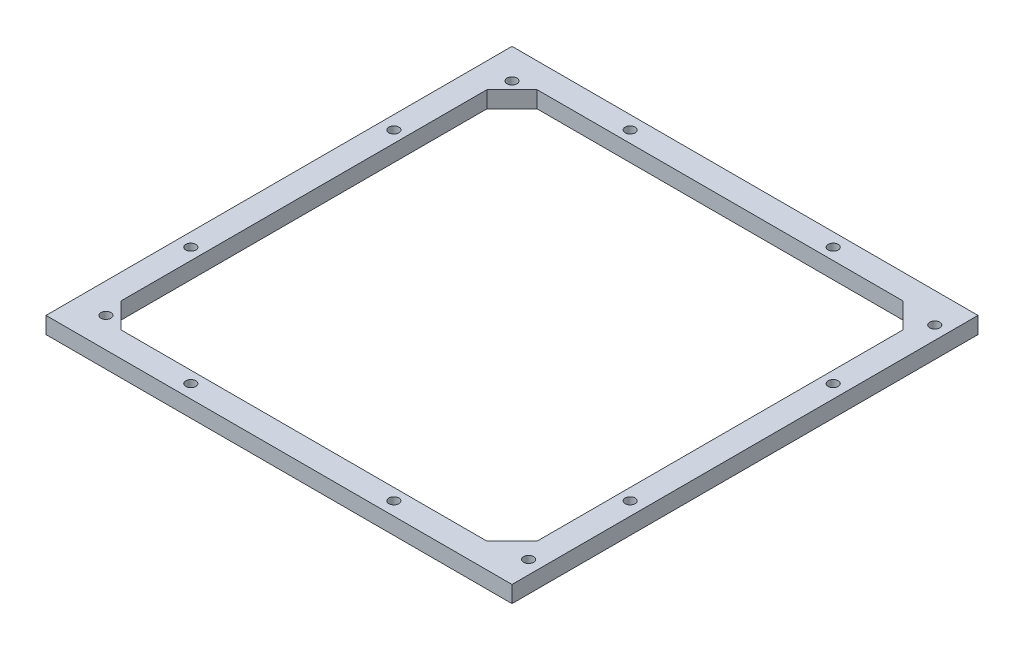
ISO-10303-21;
HEADER;
FILE_DESCRIPTION(('STEP AP214'),'2;1');
FILE_NAME('part.step','',(''),(''),'','','');
FILE_SCHEMA(('AUTOMOTIVE_DESIGN { 1 0 10303 214 1 1 1 1 }'));
ENDSEC;
DATA;
#1=APPLICATION_CONTEXT('core data for automotive mechanical design processes');
#2=APPLICATION_PROTOCOL_DEFINITION('international standard','automotive_design',2000,#1);
#3=PRODUCT_CONTEXT('',#1,'mechanical');
#4=PRODUCT('Part','Part','',(#3));
#5=PRODUCT_RELATED_PRODUCT_CATEGORY('part','',(#4));
#6=PRODUCT_DEFINITION_FORMATION('','',#4);
#7=PRODUCT_DEFINITION_CONTEXT('part definition',#1,'design');
#8=PRODUCT_DEFINITION('design','',#6,#7);
#9=PRODUCT_DEFINITION_SHAPE('','',#8);
#10=(LENGTH_UNIT() NAMED_UNIT(*) SI_UNIT(.MILLI.,.METRE.));
#11=(NAMED_UNIT(*) PLANE_ANGLE_UNIT() SI_UNIT($,.RADIAN.));
#12=(NAMED_UNIT(*) SI_UNIT($,.STERADIAN.) SOLID_ANGLE_UNIT());
#13=UNCERTAINTY_MEASURE_WITH_UNIT(LENGTH_MEASURE(1.E-05),#10,'distance_accuracy_value','');
#14=(GEOMETRIC_REPRESENTATION_CONTEXT(3) GLOBAL_UNCERTAINTY_ASSIGNED_CONTEXT((#13)) GLOBAL_UNIT_ASSIGNED_CONTEXT((#10,
#11,#12)) REPRESENTATION_CONTEXT('',''));
#15=CARTESIAN_POINT('',(0.,0.,0.));
#16=DIRECTION('',(0.,0.,1.));
#17=DIRECTION('',(1.,0.,0.));
#18=AXIS2_PLACEMENT_3D('',#15,#16,#17);
#19=CARTESIAN_POINT('',(0.,5.,0.));
#20=DIRECTION('',(0.,1.,0.));
#21=DIRECTION('',(0.,0.,1.));
#22=AXIS2_PLACEMENT_3D('',#19,#20,#21);
#23=PLANE('',#22);
#24=CARTESIAN_POINT('',(-66.,5.,-30.5));
#25=DIRECTION('',(0.,1.,0.));
#26=DIRECTION('',(0.,0.,-1.));
#27=AXIS2_PLACEMENT_3D('',#24,#25,#26);
#28=CIRCLE('',#27,1.5);
#29=CARTESIAN_POINT('',(-66.,5.,-32.));
#30=VERTEX_POINT('',#29);
#31=EDGE_CURVE('E346',#30,#30,#28,.T.);
#32=ORIENTED_EDGE('',*,*,#31,.F.);
#33=EDGE_LOOP('',(#32));
#34=FACE_BOUND('',#33,.T.);
#35=CARTESIAN_POINT('',(-30.5,5.,-66.));
#36=DIRECTION('',(0.,1.,0.));
#37=DIRECTION('',(0.,0.,-1.));
#38=AXIS2_PLACEMENT_3D('',#35,#36,#37);
#39=CIRCLE('',#38,1.5);
#40=CARTESIAN_POINT('',(-30.5,5.,-67.5));
#41=VERTEX_POINT('',#40);
#42=EDGE_CURVE('E358',#41,#41,#39,.T.);
#43=ORIENTED_EDGE('',*,*,#42,.F.);
#44=EDGE_LOOP('',(#43));
#45=FACE_BOUND('',#44,.T.);
#46=CARTESIAN_POINT('',(-30.5,5.,66.));
#47=DIRECTION('',(0.,1.,0.));
#48=DIRECTION('',(0.,0.,1.));
#49=AXIS2_PLACEMENT_3D('',#46,#47,#48);
#50=CIRCLE('',#49,1.5);
#51=CARTESIAN_POINT('',(-30.5,5.,67.5));
#52=VERTEX_POINT('',#51);
#53=EDGE_CURVE('E370',#52,#52,#50,.T.);
#54=ORIENTED_EDGE('',*,*,#53,.F.);
#55=EDGE_LOOP('',(#54));
#56=FACE_BOUND('',#55,.T.);
#57=CARTESIAN_POINT('',(66.,5.,-30.5));
#58=DIRECTION('',(0.,1.,0.));
#59=DIRECTION('',(0.,0.,1.));
#60=AXIS2_PLACEMENT_3D('',#57,#58,#59);
#61=CIRCLE('',#60,1.5);
#62=CARTESIAN_POINT('',(66.,5.,-29.));
#63=VERTEX_POINT('',#62);
#64=EDGE_CURVE('E382',#63,#63,#61,.T.);
#65=ORIENTED_EDGE('',*,*,#64,.F.);
#66=EDGE_LOOP('',(#65));
#67=FACE_BOUND('',#66,.T.);
#68=CARTESIAN_POINT('',(66.,5.,61.));
#69=DIRECTION('',(0.,1.,0.));
#70=DIRECTION('',(0.,0.,1.));
#71=AXIS2_PLACEMENT_3D('',#68,#69,#70);
#72=CIRCLE('',#71,1.5);
#73=CARTESIAN_POINT('',(66.,5.,62.5));
#74=VERTEX_POINT('',#73);
#75=EDGE_CURVE('E394',#74,#74,#72,.T.);
#76=ORIENTED_EDGE('',*,*,#75,.F.);
#77=EDGE_LOOP('',(#76));
#78=FACE_BOUND('',#77,.T.);
#79=CARTESIAN_POINT('',(-61.,5.,-61.));
#80=DIRECTION('',(0.,1.,0.));
#81=DIRECTION('',(0.,0.,1.));
#82=AXIS2_PLACEMENT_3D('',#79,#80,#81);
#83=CIRCLE('',#82,1.5);
#84=CARTESIAN_POINT('',(-61.,5.,-59.5));
#85=VERTEX_POINT('',#84);
#86=EDGE_CURVE('E160',#85,#85,#83,.T.);
#87=ORIENTED_EDGE('',*,*,#86,.F.);
#88=EDGE_LOOP('',(#87));
#89=FACE_BOUND('',#88,.T.);
#90=DIRECTION('',(0.,0.,1.));
#91=VECTOR('',#90,1.);
#92=CARTESIAN_POINT('',(-70.,5.,70.));
#93=LINE('',#92,#91);
#94=CARTESIAN_POINT('',(-70.,5.,-70.));
#95=VERTEX_POINT('',#94);
#96=CARTESIAN_POINT('',(-70.,5.,70.));
#97=VERTEX_POINT('',#96);
#98=EDGE_CURVE('E190',#95,#97,#93,.T.);
#99=ORIENTED_EDGE('',*,*,#98,.T.);
#100=DIRECTION('',(1.,0.,0.));
#101=VECTOR('',#100,1.);
#102=CARTESIAN_POINT('',(70.,5.,70.));
#103=LINE('',#102,#101);
#104=CARTESIAN_POINT('',(70.,5.,70.));
#105=VERTEX_POINT('',#104);
#106=EDGE_CURVE('E193',#97,#105,#103,.T.);
#107=ORIENTED_EDGE('',*,*,#106,.T.);
#108=DIRECTION('',(0.,0.,-1.));
#109=VECTOR('',#108,1.);
#110=CARTESIAN_POINT('',(70.,5.,70.));
#111=LINE('',#110,#109);
#112=CARTESIAN_POINT('',(70.,5.,-70.));
#113=VERTEX_POINT('',#112);
#114=EDGE_CURVE('E196',#105,#113,#111,.T.);
#115=ORIENTED_EDGE('',*,*,#114,.T.);
#116=DIRECTION('',(-1.,0.,0.));
#117=VECTOR('',#116,1.);
#118=CARTESIAN_POINT('',(70.,5.,-70.));
#119=LINE('',#118,#117);
#120=EDGE_CURVE('E198',#113,#95,#119,.T.);
#121=ORIENTED_EDGE('',*,*,#120,.T.);
#122=EDGE_LOOP('',(#99,#107,#115,#121));
#123=FACE_BOUND('',#122,.T.);
#124=DIRECTION('',(0.,0.,1.));
#125=VECTOR('',#124,1.);
#126=CARTESIAN_POINT('',(-62.5,5.,55.));
#127=LINE('',#126,#125);
#128=CARTESIAN_POINT('',(-62.5,5.,-55.));
#129=VERTEX_POINT('',#128);
#130=CARTESIAN_POINT('',(-62.5,5.,55.));
#131=VERTEX_POINT('',#130);
#132=EDGE_CURVE('E130',#129,#131,#127,.T.);
#133=ORIENTED_EDGE('',*,*,#132,.F.);
#134=DIRECTION('',(-0.707106781186547,0.,0.707106781186548));
#135=VECTOR('',#134,1.);
#136=CARTESIAN_POINT('',(-62.5,5.,-55.));
#137=LINE('',#136,#135);
#138=CARTESIAN_POINT('',(-55.,5.,-62.5));
#139=VERTEX_POINT('',#138);
#140=EDGE_CURVE('E122',#139,#129,#137,.T.);
#141=ORIENTED_EDGE('',*,*,#140,.F.);
#142=DIRECTION('',(-1.,0.,0.));
#143=VECTOR('',#142,1.);
#144=CARTESIAN_POINT('',(-55.,5.,-62.5));
#145=LINE('',#144,#143);
#146=CARTESIAN_POINT('',(55.,5.,-62.5));
#147=VERTEX_POINT('',#146);
#148=EDGE_CURVE('E157',#147,#139,#145,.T.);
#149=ORIENTED_EDGE('',*,*,#148,.F.);
#150=DIRECTION('',(-0.707106781186548,0.,-0.707106781186547));
#151=VECTOR('',#150,1.);
#152=CARTESIAN_POINT('',(55.,5.,-62.5));
#153=LINE('',#152,#151);
#154=CARTESIAN_POINT('',(62.5,5.,-55.));
#155=VERTEX_POINT('',#154);
#156=EDGE_CURVE('E155',#155,#147,#153,.T.);
#157=ORIENTED_EDGE('',*,*,#156,.F.);
#158=DIRECTION('',(0.,0.,-1.));
#159=VECTOR('',#158,1.);
#160=CARTESIAN_POINT('',(62.5,5.,-55.));
#161=LINE('',#160,#159);
#162=CARTESIAN_POINT('',(62.5,5.,55.));
#163=VERTEX_POINT('',#162);
#164=EDGE_CURVE('E153',#163,#155,#161,.T.);
#165=ORIENTED_EDGE('',*,*,#164,.F.);
#166=DIRECTION('',(0.707106781186547,0.,-0.707106781186548));
#167=VECTOR('',#166,1.);
#168=CARTESIAN_POINT('',(62.5,5.,55.));
#169=LINE('',#168,#167);
#170=CARTESIAN_POINT('',(55.,5.,62.5));
#171=VERTEX_POINT('',#170);
#172=EDGE_CURVE('E151',#171,#163,#169,.T.);
#173=ORIENTED_EDGE('',*,*,#172,.F.);
#174=DIRECTION('',(1.,0.,0.));
#175=VECTOR('',#174,1.);
#176=CARTESIAN_POINT('',(55.,5.,62.5));
#177=LINE('',#176,#175);
#178=CARTESIAN_POINT('',(-55.,5.,62.5));
#179=VERTEX_POINT('',#178);
#180=EDGE_CURVE('E146',#179,#171,#177,.T.);
#181=ORIENTED_EDGE('',*,*,#180,.F.);
#182=DIRECTION('',(0.707106781186548,0.,0.707106781186547));
#183=VECTOR('',#182,1.);
#184=CARTESIAN_POINT('',(-55.,5.,62.5));
#185=LINE('',#184,#183);
#186=EDGE_CURVE('E144',#131,#179,#185,.T.);
#187=ORIENTED_EDGE('',*,*,#186,.F.);
#188=EDGE_LOOP('',(#133,#141,#149,#157,#165,#173,#181,#187));
#189=FACE_BOUND('',#188,.T.);
#190=CARTESIAN_POINT('',(66.,5.,-61.));
#191=DIRECTION('',(0.,1.,0.));
#192=DIRECTION('',(0.,0.,1.));
#193=AXIS2_PLACEMENT_3D('',#190,#191,#192);
#194=CIRCLE('',#193,1.5);
#195=CARTESIAN_POINT('',(66.,5.,-59.5));
#196=VERTEX_POINT('',#195);
#197=EDGE_CURVE('E400',#196,#196,#194,.T.);
#198=ORIENTED_EDGE('',*,*,#197,.F.);
#199=EDGE_LOOP('',(#198));
#200=FACE_BOUND('',#199,.T.);
#201=CARTESIAN_POINT('',(-61.,5.,61.));
#202=DIRECTION('',(0.,1.,0.));
#203=DIRECTION('',(0.,0.,1.));
#204=AXIS2_PLACEMENT_3D('',#201,#202,#203);
#205=CIRCLE('',#204,1.5);
#206=CARTESIAN_POINT('',(-61.,5.,62.5));
#207=VERTEX_POINT('',#206);
#208=EDGE_CURVE('E388',#207,#207,#205,.T.);
#209=ORIENTED_EDGE('',*,*,#208,.F.);
#210=EDGE_LOOP('',(#209));
#211=FACE_BOUND('',#210,.T.);
#212=CARTESIAN_POINT('',(66.,5.,30.5));
#213=DIRECTION('',(0.,1.,0.));
#214=DIRECTION('',(0.,0.,1.));
#215=AXIS2_PLACEMENT_3D('',#212,#213,#214);
#216=CIRCLE('',#215,1.5);
#217=CARTESIAN_POINT('',(66.,5.,32.));
#218=VERTEX_POINT('',#217);
#219=EDGE_CURVE('E376',#218,#218,#216,.T.);
#220=ORIENTED_EDGE('',*,*,#219,.F.);
#221=EDGE_LOOP('',(#220));
#222=FACE_BOUND('',#221,.T.);
#223=CARTESIAN_POINT('',(30.5,5.,66.));
#224=DIRECTION('',(0.,1.,0.));
#225=DIRECTION('',(0.,0.,1.));
#226=AXIS2_PLACEMENT_3D('',#223,#224,#225);
#227=CIRCLE('',#226,1.5);
#228=CARTESIAN_POINT('',(30.5,5.,67.5));
#229=VERTEX_POINT('',#228);
#230=EDGE_CURVE('E364',#229,#229,#227,.T.);
#231=ORIENTED_EDGE('',*,*,#230,.F.);
#232=EDGE_LOOP('',(#231));
#233=FACE_BOUND('',#232,.T.);
#234=CARTESIAN_POINT('',(30.5,5.,-66.));
#235=DIRECTION('',(0.,1.,0.));
#236=DIRECTION('',(0.,0.,-1.));
#237=AXIS2_PLACEMENT_3D('',#234,#235,#236);
#238=CIRCLE('',#237,1.5);
#239=CARTESIAN_POINT('',(30.5,5.,-67.5));
#240=VERTEX_POINT('',#239);
#241=EDGE_CURVE('E352',#240,#240,#238,.T.);
#242=ORIENTED_EDGE('',*,*,#241,.F.);
#243=EDGE_LOOP('',(#242));
#244=FACE_BOUND('',#243,.T.);
#245=CARTESIAN_POINT('',(-66.,5.,30.5));
#246=DIRECTION('',(0.,1.,0.));
#247=DIRECTION('',(0.,0.,-1.));
#248=AXIS2_PLACEMENT_3D('',#245,#246,#247);
#249=CIRCLE('',#248,1.5);
#250=CARTESIAN_POINT('',(-66.,5.,29.));
#251=VERTEX_POINT('',#250);
#252=EDGE_CURVE('E337',#251,#251,#249,.T.);
#253=ORIENTED_EDGE('',*,*,#252,.F.);
#254=EDGE_LOOP('',(#253));
#255=FACE_BOUND('',#254,.T.);
#256=ADVANCED_FACE('F33',(#34,#45,#56,#67,#78,#89,#123,#189,#200,#211,#222,#233,#244,#255),#23,.T.);
#257=CARTESIAN_POINT('',(0.,0.,0.));
#258=DIRECTION('',(0.,1.,0.));
#259=DIRECTION('',(0.,0.,1.));
#260=AXIS2_PLACEMENT_3D('',#257,#258,#259);
#261=PLANE('',#260);
#262=DIRECTION('',(0.,0.,1.));
#263=VECTOR('',#262,1.);
#264=CARTESIAN_POINT('',(-70.,0.,70.));
#265=LINE('',#264,#263);
#266=CARTESIAN_POINT('',(-70.,0.,-70.));
#267=VERTEX_POINT('',#266);
#268=CARTESIAN_POINT('',(-70.,0.,70.));
#269=VERTEX_POINT('',#268);
#270=EDGE_CURVE('E138',#267,#269,#265,.T.);
#271=ORIENTED_EDGE('',*,*,#270,.F.);
#272=DIRECTION('',(-1.,0.,0.));
#273=VECTOR('',#272,1.);
#274=CARTESIAN_POINT('',(70.,0.,-70.));
#275=LINE('',#274,#273);
#276=CARTESIAN_POINT('',(70.,0.,-70.));
#277=VERTEX_POINT('',#276);
#278=EDGE_CURVE('E194',#277,#267,#275,.T.);
#279=ORIENTED_EDGE('',*,*,#278,.F.);
#280=DIRECTION('',(0.,0.,-1.));
#281=VECTOR('',#280,1.);
#282=CARTESIAN_POINT('',(70.,0.,70.));
#283=LINE('',#282,#281);
#284=CARTESIAN_POINT('',(70.,0.,70.));
#285=VERTEX_POINT('',#284);
#286=EDGE_CURVE('E205',#285,#277,#283,.T.);
#287=ORIENTED_EDGE('',*,*,#286,.F.);
#288=DIRECTION('',(1.,0.,0.));
#289=VECTOR('',#288,1.);
#290=CARTESIAN_POINT('',(70.,0.,70.));
#291=LINE('',#290,#289);
#292=EDGE_CURVE('E203',#269,#285,#291,.T.);
#293=ORIENTED_EDGE('',*,*,#292,.F.);
#294=EDGE_LOOP('',(#271,#279,#287,#293));
#295=FACE_BOUND('',#294,.T.);
#296=DIRECTION('',(-0.707106781186547,0.,0.707106781186548));
#297=VECTOR('',#296,1.);
#298=CARTESIAN_POINT('',(-62.5,0.,-55.));
#299=LINE('',#298,#297);
#300=CARTESIAN_POINT('',(-55.,0.,-62.5));
#301=VERTEX_POINT('',#300);
#302=CARTESIAN_POINT('',(-62.5,0.,-55.));
#303=VERTEX_POINT('',#302);
#304=EDGE_CURVE('E56',#301,#303,#299,.T.);
#305=ORIENTED_EDGE('',*,*,#304,.T.);
#306=DIRECTION('',(0.,0.,1.));
#307=VECTOR('',#306,1.);
#308=CARTESIAN_POINT('',(-62.5,0.,55.));
#309=LINE('',#308,#307);
#310=CARTESIAN_POINT('',(-62.5,0.,55.));
#311=VERTEX_POINT('',#310);
#312=EDGE_CURVE('E137',#303,#311,#309,.T.);
#313=ORIENTED_EDGE('',*,*,#312,.T.);
#314=DIRECTION('',(0.707106781186548,0.,0.707106781186547));
#315=VECTOR('',#314,1.);
#316=CARTESIAN_POINT('',(-55.,0.,62.5));
#317=LINE('',#316,#315);
#318=CARTESIAN_POINT('',(-55.,0.,62.5));
#319=VERTEX_POINT('',#318);
#320=EDGE_CURVE('E162',#311,#319,#317,.T.);
#321=ORIENTED_EDGE('',*,*,#320,.T.);
#322=DIRECTION('',(1.,0.,0.));
#323=VECTOR('',#322,1.);
#324=CARTESIAN_POINT('',(55.,0.,62.5));
#325=LINE('',#324,#323);
#326=CARTESIAN_POINT('',(55.,0.,62.5));
#327=VERTEX_POINT('',#326);
#328=EDGE_CURVE('E165',#319,#327,#325,.T.);
#329=ORIENTED_EDGE('',*,*,#328,.T.);
#330=DIRECTION('',(0.707106781186547,0.,-0.707106781186548));
#331=VECTOR('',#330,1.);
#332=CARTESIAN_POINT('',(62.5,0.,55.));
#333=LINE('',#332,#331);
#334=CARTESIAN_POINT('',(62.5,0.,55.));
#335=VERTEX_POINT('',#334);
#336=EDGE_CURVE('E168',#327,#335,#333,.T.);
#337=ORIENTED_EDGE('',*,*,#336,.T.);
#338=DIRECTION('',(0.,0.,-1.));
#339=VECTOR('',#338,1.);
#340=CARTESIAN_POINT('',(62.5,0.,-55.));
#341=LINE('',#340,#339);
#342=CARTESIAN_POINT('',(62.5,0.,-55.));
#343=VERTEX_POINT('',#342);
#344=EDGE_CURVE('E171',#335,#343,#341,.T.);
#345=ORIENTED_EDGE('',*,*,#344,.T.);
#346=DIRECTION('',(-0.707106781186548,0.,-0.707106781186547));
#347=VECTOR('',#346,1.);
#348=CARTESIAN_POINT('',(55.,0.,-62.5));
#349=LINE('',#348,#347);
#350=CARTESIAN_POINT('',(55.,0.,-62.5));
#351=VERTEX_POINT('',#350);
#352=EDGE_CURVE('E174',#343,#351,#349,.T.);
#353=ORIENTED_EDGE('',*,*,#352,.T.);
#354=DIRECTION('',(-1.,0.,0.));
#355=VECTOR('',#354,1.);
#356=CARTESIAN_POINT('',(-55.,0.,-62.5));
#357=LINE('',#356,#355);
#358=EDGE_CURVE('E131',#351,#301,#357,.T.);
#359=ORIENTED_EDGE('',*,*,#358,.T.);
#360=EDGE_LOOP('',(#305,#313,#321,#329,#337,#345,#353,#359));
#361=FACE_BOUND('',#360,.T.);
#362=CARTESIAN_POINT('',(-61.,0.,-61.));
#363=DIRECTION('',(0.,1.,0.));
#364=DIRECTION('',(0.,0.,1.));
#365=AXIS2_PLACEMENT_3D('',#362,#363,#364);
#366=CIRCLE('',#365,1.5);
#367=CARTESIAN_POINT('',(-61.,0.,-59.5));
#368=VERTEX_POINT('',#367);
#369=EDGE_CURVE('E403',#368,#368,#366,.T.);
#370=ORIENTED_EDGE('',*,*,#369,.T.);
#371=EDGE_LOOP('',(#370));
#372=FACE_BOUND('',#371,.T.);
#373=CARTESIAN_POINT('',(66.,0.,-61.));
#374=DIRECTION('',(0.,1.,0.));
#375=DIRECTION('',(0.,0.,1.));
#376=AXIS2_PLACEMENT_3D('',#373,#374,#375);
#377=CIRCLE('',#376,1.5);
#378=CARTESIAN_POINT('',(66.,0.,-59.5));
#379=VERTEX_POINT('',#378);
#380=EDGE_CURVE('E397',#379,#379,#377,.T.);
#381=ORIENTED_EDGE('',*,*,#380,.T.);
#382=EDGE_LOOP('',(#381));
#383=FACE_BOUND('',#382,.T.);
#384=CARTESIAN_POINT('',(66.,0.,61.));
#385=DIRECTION('',(0.,1.,0.));
#386=DIRECTION('',(0.,0.,1.));
#387=AXIS2_PLACEMENT_3D('',#384,#385,#386);
#388=CIRCLE('',#387,1.5);
#389=CARTESIAN_POINT('',(66.,0.,62.5));
#390=VERTEX_POINT('',#389);
#391=EDGE_CURVE('E391',#390,#390,#388,.T.);
#392=ORIENTED_EDGE('',*,*,#391,.T.);
#393=EDGE_LOOP('',(#392));
#394=FACE_BOUND('',#393,.T.);
#395=CARTESIAN_POINT('',(-61.,0.,61.));
#396=DIRECTION('',(0.,1.,0.));
#397=DIRECTION('',(0.,0.,1.));
#398=AXIS2_PLACEMENT_3D('',#395,#396,#397);
#399=CIRCLE('',#398,1.5);
#400=CARTESIAN_POINT('',(-61.,0.,62.5));
#401=VERTEX_POINT('',#400);
#402=EDGE_CURVE('E385',#401,#401,#399,.T.);
#403=ORIENTED_EDGE('',*,*,#402,.T.);
#404=EDGE_LOOP('',(#403));
#405=FACE_BOUND('',#404,.T.);
#406=CARTESIAN_POINT('',(66.,0.,-30.5));
#407=DIRECTION('',(0.,1.,0.));
#408=DIRECTION('',(0.,0.,1.));
#409=AXIS2_PLACEMENT_3D('',#406,#407,#408);
#410=CIRCLE('',#409,1.5);
#411=CARTESIAN_POINT('',(66.,0.,-29.));
#412=VERTEX_POINT('',#411);
#413=EDGE_CURVE('E379',#412,#412,#410,.T.);
#414=ORIENTED_EDGE('',*,*,#413,.T.);
#415=EDGE_LOOP('',(#414));
#416=FACE_BOUND('',#415,.T.);
#417=CARTESIAN_POINT('',(66.,0.,30.5));
#418=DIRECTION('',(0.,1.,0.));
#419=DIRECTION('',(0.,0.,1.));
#420=AXIS2_PLACEMENT_3D('',#417,#418,#419);
#421=CIRCLE('',#420,1.5);
#422=CARTESIAN_POINT('',(66.,0.,32.));
#423=VERTEX_POINT('',#422);
#424=EDGE_CURVE('E373',#423,#423,#421,.T.);
#425=ORIENTED_EDGE('',*,*,#424,.T.);
#426=EDGE_LOOP('',(#425));
#427=FACE_BOUND('',#426,.T.);
#428=CARTESIAN_POINT('',(-30.5,0.,66.));
#429=DIRECTION('',(0.,1.,0.));
#430=DIRECTION('',(0.,0.,1.));
#431=AXIS2_PLACEMENT_3D('',#428,#429,#430);
#432=CIRCLE('',#431,1.5);
#433=CARTESIAN_POINT('',(-30.5,0.,67.5));
#434=VERTEX_POINT('',#433);
#435=EDGE_CURVE('E367',#434,#434,#432,.T.);
#436=ORIENTED_EDGE('',*,*,#435,.T.);
#437=EDGE_LOOP('',(#436));
#438=FACE_BOUND('',#437,.T.);
#439=CARTESIAN_POINT('',(30.5,0.,66.));
#440=DIRECTION('',(0.,1.,0.));
#441=DIRECTION('',(0.,0.,1.));
#442=AXIS2_PLACEMENT_3D('',#439,#440,#441);
#443=CIRCLE('',#442,1.5);
#444=CARTESIAN_POINT('',(30.5,0.,67.5));
#445=VERTEX_POINT('',#444);
#446=EDGE_CURVE('E361',#445,#445,#443,.T.);
#447=ORIENTED_EDGE('',*,*,#446,.T.);
#448=EDGE_LOOP('',(#447));
#449=FACE_BOUND('',#448,.T.);
#450=CARTESIAN_POINT('',(-30.5,0.,-66.));
#451=DIRECTION('',(0.,1.,0.));
#452=DIRECTION('',(0.,0.,-1.));
#453=AXIS2_PLACEMENT_3D('',#450,#451,#452);
#454=CIRCLE('',#453,1.5);
#455=CARTESIAN_POINT('',(-30.5,0.,-67.5));
#456=VERTEX_POINT('',#455);
#457=EDGE_CURVE('E355',#456,#456,#454,.T.);
#458=ORIENTED_EDGE('',*,*,#457,.T.);
#459=EDGE_LOOP('',(#458));
#460=FACE_BOUND('',#459,.T.);
#461=CARTESIAN_POINT('',(30.5,0.,-66.));
#462=DIRECTION('',(0.,1.,0.));
#463=DIRECTION('',(0.,0.,-1.));
#464=AXIS2_PLACEMENT_3D('',#461,#462,#463);
#465=CIRCLE('',#464,1.5);
#466=CARTESIAN_POINT('',(30.5,0.,-67.5));
#467=VERTEX_POINT('',#466);
#468=EDGE_CURVE('E349',#467,#467,#465,.T.);
#469=ORIENTED_EDGE('',*,*,#468,.T.);
#470=EDGE_LOOP('',(#469));
#471=FACE_BOUND('',#470,.T.);
#472=CARTESIAN_POINT('',(-66.,0.,-30.5));
#473=DIRECTION('',(0.,1.,0.));
#474=DIRECTION('',(0.,0.,-1.));
#475=AXIS2_PLACEMENT_3D('',#472,#473,#474);
#476=CIRCLE('',#475,1.5);
#477=CARTESIAN_POINT('',(-66.,0.,-32.));
#478=VERTEX_POINT('',#477);
#479=EDGE_CURVE('E343',#478,#478,#476,.T.);
#480=ORIENTED_EDGE('',*,*,#479,.T.);
#481=EDGE_LOOP('',(#480));
#482=FACE_BOUND('',#481,.T.);
#483=CARTESIAN_POINT('',(-66.,0.,30.5));
#484=DIRECTION('',(0.,1.,0.));
#485=DIRECTION('',(0.,0.,-1.));
#486=AXIS2_PLACEMENT_3D('',#483,#484,#485);
#487=CIRCLE('',#486,1.5);
#488=CARTESIAN_POINT('',(-66.,0.,29.));
#489=VERTEX_POINT('',#488);
#490=EDGE_CURVE('E340',#489,#489,#487,.T.);
#491=ORIENTED_EDGE('',*,*,#490,.T.);
#492=EDGE_LOOP('',(#491));
#493=FACE_BOUND('',#492,.T.);
#494=ADVANCED_FACE('F223',(#295,#361,#372,#383,#394,#405,#416,#427,#438,#449,#460,#471,#482,
#493),#261,.F.);
#495=CARTESIAN_POINT('',(-70.,5.,70.));
#496=DIRECTION('',(1.,0.,0.));
#497=DIRECTION('',(0.,0.,-1.));
#498=AXIS2_PLACEMENT_3D('',#495,#496,#497);
#499=PLANE('',#498);
#500=ORIENTED_EDGE('',*,*,#270,.T.);
#501=DIRECTION('',(0.,-1.,0.));
#502=VECTOR('',#501,1.);
#503=CARTESIAN_POINT('',(-70.,5.,70.));
#504=LINE('',#503,#502);
#505=EDGE_CURVE('E11',#97,#269,#504,.T.);
#506=ORIENTED_EDGE('',*,*,#505,.F.);
#507=ORIENTED_EDGE('',*,*,#98,.F.);
#508=DIRECTION('',(0.,-1.,0.));
#509=VECTOR('',#508,1.);
#510=CARTESIAN_POINT('',(-70.,5.,-70.));
#511=LINE('',#510,#509);
#512=EDGE_CURVE('E200',#95,#267,#511,.T.);
#513=ORIENTED_EDGE('',*,*,#512,.T.);
#514=EDGE_LOOP('',(#500,#506,#507,#513));
#515=FACE_BOUND('',#514,.T.);
#516=ADVANCED_FACE('F35',(#515),#499,.F.);
#517=CARTESIAN_POINT('',(70.,5.,70.));
#518=DIRECTION('',(0.,0.,-1.));
#519=DIRECTION('',(-1.,0.,0.));
#520=AXIS2_PLACEMENT_3D('',#517,#518,#519);
#521=PLANE('',#520);
#522=ORIENTED_EDGE('',*,*,#292,.T.);
#523=DIRECTION('',(0.,-1.,0.));
#524=VECTOR('',#523,1.);
#525=CARTESIAN_POINT('',(70.,5.,70.));
#526=LINE('',#525,#524);
#527=EDGE_CURVE('E41',#105,#285,#526,.T.);
#528=ORIENTED_EDGE('',*,*,#527,.F.);
#529=ORIENTED_EDGE('',*,*,#106,.F.);
#530=ORIENTED_EDGE('',*,*,#505,.T.);
#531=EDGE_LOOP('',(#522,#528,#529,#530));
#532=FACE_BOUND('',#531,.T.);
#533=ADVANCED_FACE('F233',(#532),#521,.F.);
#534=CARTESIAN_POINT('',(70.,5.,70.));
#535=DIRECTION('',(-1.,0.,0.));
#536=DIRECTION('',(0.,0.,1.));
#537=AXIS2_PLACEMENT_3D('',#534,#535,#536);
#538=PLANE('',#537);
#539=ORIENTED_EDGE('',*,*,#286,.T.);
#540=DIRECTION('',(0.,-1.,0.));
#541=VECTOR('',#540,1.);
#542=CARTESIAN_POINT('',(70.,5.,-70.));
#543=LINE('',#542,#541);
#544=EDGE_CURVE('E210',#113,#277,#543,.T.);
#545=ORIENTED_EDGE('',*,*,#544,.F.);
#546=ORIENTED_EDGE('',*,*,#114,.F.);
#547=ORIENTED_EDGE('',*,*,#527,.T.);
#548=EDGE_LOOP('',(#539,#545,#546,#547));
#549=FACE_BOUND('',#548,.T.);
#550=ADVANCED_FACE('F217',(#549),#538,.F.);
#551=CARTESIAN_POINT('',(70.,5.,-70.));
#552=DIRECTION('',(0.,0.,1.));
#553=DIRECTION('',(1.,0.,0.));
#554=AXIS2_PLACEMENT_3D('',#551,#552,#553);
#555=PLANE('',#554);
#556=ORIENTED_EDGE('',*,*,#278,.T.);
#557=ORIENTED_EDGE('',*,*,#512,.F.);
#558=ORIENTED_EDGE('',*,*,#120,.F.);
#559=ORIENTED_EDGE('',*,*,#544,.T.);
#560=EDGE_LOOP('',(#556,#557,#558,#559));
#561=FACE_BOUND('',#560,.T.);
#562=ADVANCED_FACE('F227',(#561),#555,.F.);
#563=CARTESIAN_POINT('',(-62.5,5.,-55.));
#564=DIRECTION('',(0.707106781186548,0.,0.707106781186547));
#565=DIRECTION('',(0.707106781186547,0.,-0.707106781186548));
#566=AXIS2_PLACEMENT_3D('',#563,#564,#565);
#567=PLANE('',#566);
#568=ORIENTED_EDGE('',*,*,#304,.F.);
#569=DIRECTION('',(0.,-1.,0.));
#570=VECTOR('',#569,1.);
#571=CARTESIAN_POINT('',(-55.,5.,-62.5));
#572=LINE('',#571,#570);
#573=EDGE_CURVE('E126',#139,#301,#572,.T.);
#574=ORIENTED_EDGE('',*,*,#573,.F.);
#575=ORIENTED_EDGE('',*,*,#140,.T.);
#576=DIRECTION('',(0.,-1.,0.));
#577=VECTOR('',#576,1.);
#578=CARTESIAN_POINT('',(-62.5,5.,-55.));
#579=LINE('',#578,#577);
#580=EDGE_CURVE('E125',#129,#303,#579,.T.);
#581=ORIENTED_EDGE('',*,*,#580,.T.);
#582=EDGE_LOOP('',(#568,#574,#575,#581));
#583=FACE_BOUND('',#582,.T.);
#584=ADVANCED_FACE('F124',(#583),#567,.T.);
#585=CARTESIAN_POINT('',(-62.5,5.,55.));
#586=DIRECTION('',(1.,0.,0.));
#587=DIRECTION('',(0.,0.,-1.));
#588=AXIS2_PLACEMENT_3D('',#585,#586,#587);
#589=PLANE('',#588);
#590=ORIENTED_EDGE('',*,*,#312,.F.);
#591=ORIENTED_EDGE('',*,*,#580,.F.);
#592=ORIENTED_EDGE('',*,*,#132,.T.);
#593=DIRECTION('',(0.,-1.,0.));
#594=VECTOR('',#593,1.);
#595=CARTESIAN_POINT('',(-62.5,5.,55.));
#596=LINE('',#595,#594);
#597=EDGE_CURVE('E139',#131,#311,#596,.T.);
#598=ORIENTED_EDGE('',*,*,#597,.T.);
#599=EDGE_LOOP('',(#590,#591,#592,#598));
#600=FACE_BOUND('',#599,.T.);
#601=ADVANCED_FACE('F134',(#600),#589,.T.);
#602=CARTESIAN_POINT('',(-55.,5.,62.5));
#603=DIRECTION('',(0.707106781186547,0.,-0.707106781186548));
#604=DIRECTION('',(-0.707106781186548,0.,-0.707106781186547));
#605=AXIS2_PLACEMENT_3D('',#602,#603,#604);
#606=PLANE('',#605);
#607=ORIENTED_EDGE('',*,*,#320,.F.);
#608=ORIENTED_EDGE('',*,*,#597,.F.);
#609=ORIENTED_EDGE('',*,*,#186,.T.);
#610=DIRECTION('',(0.,-1.,0.));
#611=VECTOR('',#610,1.);
#612=CARTESIAN_POINT('',(-55.,5.,62.5));
#613=LINE('',#612,#611);
#614=EDGE_CURVE('E187',#179,#319,#613,.T.);
#615=ORIENTED_EDGE('',*,*,#614,.T.);
#616=EDGE_LOOP('',(#607,#608,#609,#615));
#617=FACE_BOUND('',#616,.T.);
#618=ADVANCED_FACE('F259',(#617),#606,.T.);
#619=CARTESIAN_POINT('',(55.,5.,62.5));
#620=DIRECTION('',(0.,0.,-1.));
#621=DIRECTION('',(-1.,0.,0.));
#622=AXIS2_PLACEMENT_3D('',#619,#620,#621);
#623=PLANE('',#622);
#624=ORIENTED_EDGE('',*,*,#328,.F.);
#625=ORIENTED_EDGE('',*,*,#614,.F.);
#626=ORIENTED_EDGE('',*,*,#180,.T.);
#627=DIRECTION('',(0.,-1.,0.));
#628=VECTOR('',#627,1.);
#629=CARTESIAN_POINT('',(55.,5.,62.5));
#630=LINE('',#629,#628);
#631=EDGE_CURVE('E185',#171,#327,#630,.T.);
#632=ORIENTED_EDGE('',*,*,#631,.T.);
#633=EDGE_LOOP('',(#624,#625,#626,#632));
#634=FACE_BOUND('',#633,.T.);
#635=ADVANCED_FACE('F263',(#634),#623,.T.);
#636=CARTESIAN_POINT('',(62.5,5.,55.));
#637=DIRECTION('',(-0.707106781186548,0.,-0.707106781186547));
#638=DIRECTION('',(-0.707106781186547,0.,0.707106781186548));
#639=AXIS2_PLACEMENT_3D('',#636,#637,#638);
#640=PLANE('',#639);
#641=ORIENTED_EDGE('',*,*,#336,.F.);
#642=ORIENTED_EDGE('',*,*,#631,.F.);
#643=ORIENTED_EDGE('',*,*,#172,.T.);
#644=DIRECTION('',(0.,-1.,0.));
#645=VECTOR('',#644,1.);
#646=CARTESIAN_POINT('',(62.5,5.,55.));
#647=LINE('',#646,#645);
#648=EDGE_CURVE('E183',#163,#335,#647,.T.);
#649=ORIENTED_EDGE('',*,*,#648,.T.);
#650=EDGE_LOOP('',(#641,#642,#643,#649));
#651=FACE_BOUND('',#650,.T.);
#652=ADVANCED_FACE('F269',(#651),#640,.T.);
#653=CARTESIAN_POINT('',(62.5,5.,-55.));
#654=DIRECTION('',(-1.,0.,0.));
#655=DIRECTION('',(0.,0.,1.));
#656=AXIS2_PLACEMENT_3D('',#653,#654,#655);
#657=PLANE('',#656);
#658=ORIENTED_EDGE('',*,*,#344,.F.);
#659=ORIENTED_EDGE('',*,*,#648,.F.);
#660=ORIENTED_EDGE('',*,*,#164,.T.);
#661=DIRECTION('',(0.,-1.,0.));
#662=VECTOR('',#661,1.);
#663=CARTESIAN_POINT('',(62.5,5.,-55.));
#664=LINE('',#663,#662);
#665=EDGE_CURVE('E181',#155,#343,#664,.T.);
#666=ORIENTED_EDGE('',*,*,#665,.T.);
#667=EDGE_LOOP('',(#658,#659,#660,#666));
#668=FACE_BOUND('',#667,.T.);
#669=ADVANCED_FACE('F273',(#668),#657,.T.);
#670=CARTESIAN_POINT('',(55.,5.,-62.5));
#671=DIRECTION('',(-0.707106781186547,0.,0.707106781186548));
#672=DIRECTION('',(0.707106781186548,0.,0.707106781186547));
#673=AXIS2_PLACEMENT_3D('',#670,#671,#672);
#674=PLANE('',#673);
#675=ORIENTED_EDGE('',*,*,#352,.F.);
#676=ORIENTED_EDGE('',*,*,#665,.F.);
#677=ORIENTED_EDGE('',*,*,#156,.T.);
#678=DIRECTION('',(0.,-1.,0.));
#679=VECTOR('',#678,1.);
#680=CARTESIAN_POINT('',(55.,5.,-62.5));
#681=LINE('',#680,#679);
#682=EDGE_CURVE('E48',#147,#351,#681,.T.);
#683=ORIENTED_EDGE('',*,*,#682,.T.);
#684=EDGE_LOOP('',(#675,#676,#677,#683));
#685=FACE_BOUND('',#684,.T.);
#686=ADVANCED_FACE('F277',(#685),#674,.T.);
#687=CARTESIAN_POINT('',(-55.,5.,-62.5));
#688=DIRECTION('',(0.,0.,1.));
#689=DIRECTION('',(1.,0.,0.));
#690=AXIS2_PLACEMENT_3D('',#687,#688,#689);
#691=PLANE('',#690);
#692=ORIENTED_EDGE('',*,*,#358,.F.);
#693=ORIENTED_EDGE('',*,*,#682,.F.);
#694=ORIENTED_EDGE('',*,*,#148,.T.);
#695=ORIENTED_EDGE('',*,*,#573,.T.);
#696=EDGE_LOOP('',(#692,#693,#694,#695));
#697=FACE_BOUND('',#696,.T.);
#698=ADVANCED_FACE('F281',(#697),#691,.T.);
#699=CARTESIAN_POINT('',(-61.,5.,-61.));
#700=DIRECTION('',(0.,-1.,0.));
#701=DIRECTION('',(0.,0.,-1.));
#702=AXIS2_PLACEMENT_3D('',#699,#700,#701);
#703=CYLINDRICAL_SURFACE('',#702,1.5);
#704=ORIENTED_EDGE('',*,*,#86,.T.);
#705=EDGE_LOOP('',(#704));
#706=FACE_BOUND('',#705,.T.);
#707=ORIENTED_EDGE('',*,*,#369,.F.);
#708=EDGE_LOOP('',(#707));
#709=FACE_BOUND('',#708,.T.);
#710=ADVANCED_FACE('F285',(#706,#709),#703,.F.);
#711=CARTESIAN_POINT('',(66.,5.,-61.));
#712=DIRECTION('',(0.,-1.,0.));
#713=DIRECTION('',(0.,0.,-1.));
#714=AXIS2_PLACEMENT_3D('',#711,#712,#713);
#715=CYLINDRICAL_SURFACE('',#714,1.5);
#716=ORIENTED_EDGE('',*,*,#197,.T.);
#717=EDGE_LOOP('',(#716));
#718=FACE_BOUND('',#717,.T.);
#719=ORIENTED_EDGE('',*,*,#380,.F.);
#720=EDGE_LOOP('',(#719));
#721=FACE_BOUND('',#720,.T.);
#722=ADVANCED_FACE('F288',(#718,#721),#715,.F.);
#723=CARTESIAN_POINT('',(66.,5.,61.));
#724=DIRECTION('',(0.,-1.,0.));
#725=DIRECTION('',(0.,0.,-1.));
#726=AXIS2_PLACEMENT_3D('',#723,#724,#725);
#727=CYLINDRICAL_SURFACE('',#726,1.5);
#728=ORIENTED_EDGE('',*,*,#75,.T.);
#729=EDGE_LOOP('',(#728));
#730=FACE_BOUND('',#729,.T.);
#731=ORIENTED_EDGE('',*,*,#391,.F.);
#732=EDGE_LOOP('',(#731));
#733=FACE_BOUND('',#732,.T.);
#734=ADVANCED_FACE('F292',(#730,#733),#727,.F.);
#735=CARTESIAN_POINT('',(-61.,5.,61.));
#736=DIRECTION('',(0.,-1.,0.));
#737=DIRECTION('',(0.,0.,-1.));
#738=AXIS2_PLACEMENT_3D('',#735,#736,#737);
#739=CYLINDRICAL_SURFACE('',#738,1.5);
#740=ORIENTED_EDGE('',*,*,#208,.T.);
#741=EDGE_LOOP('',(#740));
#742=FACE_BOUND('',#741,.T.);
#743=ORIENTED_EDGE('',*,*,#402,.F.);
#744=EDGE_LOOP('',(#743));
#745=FACE_BOUND('',#744,.T.);
#746=ADVANCED_FACE('F296',(#742,#745),#739,.F.);
#747=CARTESIAN_POINT('',(66.,5.,-30.5));
#748=DIRECTION('',(0.,-1.,0.));
#749=DIRECTION('',(0.,0.,-1.));
#750=AXIS2_PLACEMENT_3D('',#747,#748,#749);
#751=CYLINDRICAL_SURFACE('',#750,1.5);
#752=ORIENTED_EDGE('',*,*,#64,.T.);
#753=EDGE_LOOP('',(#752));
#754=FACE_BOUND('',#753,.T.);
#755=ORIENTED_EDGE('',*,*,#413,.F.);
#756=EDGE_LOOP('',(#755));
#757=FACE_BOUND('',#756,.T.);
#758=ADVANCED_FACE('F300',(#754,#757),#751,.F.);
#759=CARTESIAN_POINT('',(66.,5.,30.5));
#760=DIRECTION('',(0.,-1.,0.));
#761=DIRECTION('',(0.,0.,-1.));
#762=AXIS2_PLACEMENT_3D('',#759,#760,#761);
#763=CYLINDRICAL_SURFACE('',#762,1.5);
#764=ORIENTED_EDGE('',*,*,#219,.T.);
#765=EDGE_LOOP('',(#764));
#766=FACE_BOUND('',#765,.T.);
#767=ORIENTED_EDGE('',*,*,#424,.F.);
#768=EDGE_LOOP('',(#767));
#769=FACE_BOUND('',#768,.T.);
#770=ADVANCED_FACE('F304',(#766,#769),#763,.F.);
#771=CARTESIAN_POINT('',(-30.5,5.,66.));
#772=DIRECTION('',(0.,-1.,0.));
#773=DIRECTION('',(0.,0.,-1.));
#774=AXIS2_PLACEMENT_3D('',#771,#772,#773);
#775=CYLINDRICAL_SURFACE('',#774,1.5);
#776=ORIENTED_EDGE('',*,*,#53,.T.);
#777=EDGE_LOOP('',(#776));
#778=FACE_BOUND('',#777,.T.);
#779=ORIENTED_EDGE('',*,*,#435,.F.);
#780=EDGE_LOOP('',(#779));
#781=FACE_BOUND('',#780,.T.);
#782=ADVANCED_FACE('F308',(#778,#781),#775,.F.);
#783=CARTESIAN_POINT('',(30.5,5.,66.));
#784=DIRECTION('',(0.,-1.,0.));
#785=DIRECTION('',(0.,0.,-1.));
#786=AXIS2_PLACEMENT_3D('',#783,#784,#785);
#787=CYLINDRICAL_SURFACE('',#786,1.5);
#788=ORIENTED_EDGE('',*,*,#230,.T.);
#789=EDGE_LOOP('',(#788));
#790=FACE_BOUND('',#789,.T.);
#791=ORIENTED_EDGE('',*,*,#446,.F.);
#792=EDGE_LOOP('',(#791));
#793=FACE_BOUND('',#792,.T.);
#794=ADVANCED_FACE('F312',(#790,#793),#787,.F.);
#795=CARTESIAN_POINT('',(-30.5,5.,-66.));
#796=DIRECTION('',(0.,-1.,0.));
#797=DIRECTION('',(0.,0.,-1.));
#798=AXIS2_PLACEMENT_3D('',#795,#796,#797);
#799=CYLINDRICAL_SURFACE('',#798,1.5);
#800=ORIENTED_EDGE('',*,*,#42,.T.);
#801=EDGE_LOOP('',(#800));
#802=FACE_BOUND('',#801,.T.);
#803=ORIENTED_EDGE('',*,*,#457,.F.);
#804=EDGE_LOOP('',(#803));
#805=FACE_BOUND('',#804,.T.);
#806=ADVANCED_FACE('F316',(#802,#805),#799,.F.);
#807=CARTESIAN_POINT('',(30.5,5.,-66.));
#808=DIRECTION('',(0.,-1.,0.));
#809=DIRECTION('',(0.,0.,-1.));
#810=AXIS2_PLACEMENT_3D('',#807,#808,#809);
#811=CYLINDRICAL_SURFACE('',#810,1.5);
#812=ORIENTED_EDGE('',*,*,#241,.T.);
#813=EDGE_LOOP('',(#812));
#814=FACE_BOUND('',#813,.T.);
#815=ORIENTED_EDGE('',*,*,#468,.F.);
#816=EDGE_LOOP('',(#815));
#817=FACE_BOUND('',#816,.T.);
#818=ADVANCED_FACE('F320',(#814,#817),#811,.F.);
#819=CARTESIAN_POINT('',(-66.,5.,-30.5));
#820=DIRECTION('',(0.,-1.,0.));
#821=DIRECTION('',(0.,0.,-1.));
#822=AXIS2_PLACEMENT_3D('',#819,#820,#821);
#823=CYLINDRICAL_SURFACE('',#822,1.5);
#824=ORIENTED_EDGE('',*,*,#31,.T.);
#825=EDGE_LOOP('',(#824));
#826=FACE_BOUND('',#825,.T.);
#827=ORIENTED_EDGE('',*,*,#479,.F.);
#828=EDGE_LOOP('',(#827));
#829=FACE_BOUND('',#828,.T.);
#830=ADVANCED_FACE('F324',(#826,#829),#823,.F.);
#831=CARTESIAN_POINT('',(-66.,5.,30.5));
#832=DIRECTION('',(0.,-1.,0.));
#833=DIRECTION('',(0.,0.,-1.));
#834=AXIS2_PLACEMENT_3D('',#831,#832,#833);
#835=CYLINDRICAL_SURFACE('',#834,1.5);
#836=ORIENTED_EDGE('',*,*,#252,.T.);
#837=EDGE_LOOP('',(#836));
#838=FACE_BOUND('',#837,.T.);
#839=ORIENTED_EDGE('',*,*,#490,.F.);
#840=EDGE_LOOP('',(#839));
#841=FACE_BOUND('',#840,.T.);
#842=ADVANCED_FACE('F328',(#838,#841),#835,.F.);
#843=CLOSED_SHELL('',(#256,#494,#516,#533,#550,#562,#584,#601,#618,#635,#652,#669,#686,#698,
#710,#722,#734,#746,#758,#770,#782,#794,#806,#818,#830,#842));
#844=MANIFOLD_SOLID_BREP('B2',#843);
#845=ADVANCED_BREP_SHAPE_REPRESENTATION('',(#18,#844),#14);
#846=SHAPE_DEFINITION_REPRESENTATION(#9,#845);
ENDSEC;
END-ISO-10303-21;
